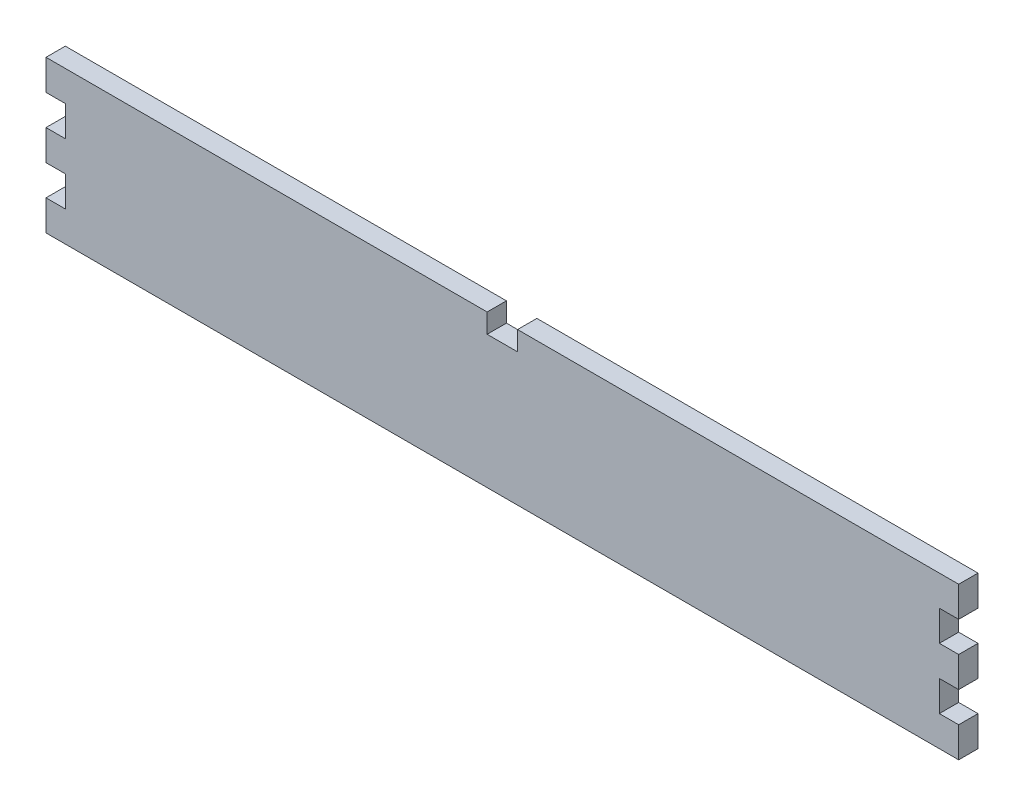
ISO-10303-21;
HEADER;
FILE_DESCRIPTION(('STEP AP214'),'2;1');
FILE_NAME('part.step','',(''),(''),'','','');
FILE_SCHEMA(('AUTOMOTIVE_DESIGN { 1 0 10303 214 1 1 1 1 }'));
ENDSEC;
DATA;
#1=APPLICATION_CONTEXT('core data for automotive mechanical design processes');
#2=APPLICATION_PROTOCOL_DEFINITION('international standard','automotive_design',2000,#1);
#3=PRODUCT_CONTEXT('',#1,'mechanical');
#4=PRODUCT('Part','Part','',(#3));
#5=PRODUCT_RELATED_PRODUCT_CATEGORY('part','',(#4));
#6=PRODUCT_DEFINITION_FORMATION('','',#4);
#7=PRODUCT_DEFINITION_CONTEXT('part definition',#1,'design');
#8=PRODUCT_DEFINITION('design','',#6,#7);
#9=PRODUCT_DEFINITION_SHAPE('','',#8);
#10=(LENGTH_UNIT() NAMED_UNIT(*) SI_UNIT(.MILLI.,.METRE.));
#11=(NAMED_UNIT(*) PLANE_ANGLE_UNIT() SI_UNIT($,.RADIAN.));
#12=(NAMED_UNIT(*) SI_UNIT($,.STERADIAN.) SOLID_ANGLE_UNIT());
#13=UNCERTAINTY_MEASURE_WITH_UNIT(LENGTH_MEASURE(1.E-05),#10,'distance_accuracy_value','');
#14=(GEOMETRIC_REPRESENTATION_CONTEXT(3) GLOBAL_UNCERTAINTY_ASSIGNED_CONTEXT((#13)) GLOBAL_UNIT_ASSIGNED_CONTEXT((#10,
#11,#12)) REPRESENTATION_CONTEXT('',''));
#15=CARTESIAN_POINT('',(0.,0.,0.));
#16=DIRECTION('',(0.,0.,1.));
#17=DIRECTION('',(1.,0.,0.));
#18=AXIS2_PLACEMENT_3D('',#15,#16,#17);
#19=CARTESIAN_POINT('',(0.,0.,6.35));
#20=DIRECTION('',(1.,0.,0.));
#21=DIRECTION('',(0.,0.,-1.));
#22=AXIS2_PLACEMENT_3D('',#19,#20,#21);
#23=PLANE('',#22);
#24=DIRECTION('',(0.,-1.,0.));
#25=VECTOR('',#24,1.);
#26=CARTESIAN_POINT('',(0.,0.,0.));
#27=LINE('',#26,#25);
#28=CARTESIAN_POINT('',(0.,30.,0.));
#29=VERTEX_POINT('',#28);
#30=CARTESIAN_POINT('',(0.,20.,0.));
#31=VERTEX_POINT('',#30);
#32=EDGE_CURVE('E415',#29,#31,#27,.T.);
#33=ORIENTED_EDGE('',*,*,#32,.T.);
#34=DIRECTION('',(0.,0.,1.));
#35=VECTOR('',#34,1.);
#36=CARTESIAN_POINT('',(0.,20.,0.));
#37=LINE('',#36,#35);
#38=CARTESIAN_POINT('',(0.,20.,6.35));
#39=VERTEX_POINT('',#38);
#40=EDGE_CURVE('E273',#31,#39,#37,.T.);
#41=ORIENTED_EDGE('',*,*,#40,.T.);
#42=DIRECTION('',(0.,-1.,0.));
#43=VECTOR('',#42,1.);
#44=CARTESIAN_POINT('',(0.,0.,6.35));
#45=LINE('',#44,#43);
#46=CARTESIAN_POINT('',(0.,30.,6.35));
#47=VERTEX_POINT('',#46);
#48=EDGE_CURVE('E394',#47,#39,#45,.T.);
#49=ORIENTED_EDGE('',*,*,#48,.F.);
#50=DIRECTION('',(0.,0.,1.));
#51=VECTOR('',#50,1.);
#52=CARTESIAN_POINT('',(0.,30.,0.));
#53=LINE('',#52,#51);
#54=EDGE_CURVE('E330',#29,#47,#53,.T.);
#55=ORIENTED_EDGE('',*,*,#54,.F.);
#56=EDGE_LOOP('',(#33,#41,#49,#55));
#57=FACE_BOUND('',#56,.T.);
#58=ADVANCED_FACE('F39',(#57),#23,.F.);
#59=CARTESIAN_POINT('',(300.,0.,6.35));
#60=DIRECTION('',(-1.,0.,0.));
#61=DIRECTION('',(0.,0.,1.));
#62=AXIS2_PLACEMENT_3D('',#59,#60,#61);
#63=PLANE('',#62);
#64=DIRECTION('',(0.,1.,0.));
#65=VECTOR('',#64,1.);
#66=CARTESIAN_POINT('',(300.,0.,6.35));
#67=LINE('',#66,#65);
#68=CARTESIAN_POINT('',(300.,40.,6.35));
#69=VERTEX_POINT('',#68);
#70=CARTESIAN_POINT('',(300.,50.,6.35));
#71=VERTEX_POINT('',#70);
#72=EDGE_CURVE('E398',#69,#71,#67,.T.);
#73=ORIENTED_EDGE('',*,*,#72,.F.);
#74=DIRECTION('',(0.,0.,1.));
#75=VECTOR('',#74,1.);
#76=CARTESIAN_POINT('',(300.,40.,0.));
#77=LINE('',#76,#75);
#78=CARTESIAN_POINT('',(300.,40.,0.));
#79=VERTEX_POINT('',#78);
#80=EDGE_CURVE('E310',#79,#69,#77,.T.);
#81=ORIENTED_EDGE('',*,*,#80,.F.);
#82=DIRECTION('',(0.,1.,0.));
#83=VECTOR('',#82,1.);
#84=CARTESIAN_POINT('',(300.,0.,0.));
#85=LINE('',#84,#83);
#86=CARTESIAN_POINT('',(300.,50.,0.));
#87=VERTEX_POINT('',#86);
#88=EDGE_CURVE('E418',#79,#87,#85,.T.);
#89=ORIENTED_EDGE('',*,*,#88,.T.);
#90=DIRECTION('',(0.,0.,-1.));
#91=VECTOR('',#90,1.);
#92=CARTESIAN_POINT('',(300.,50.,6.35));
#93=LINE('',#92,#91);
#94=EDGE_CURVE('E431',#71,#87,#93,.T.);
#95=ORIENTED_EDGE('',*,*,#94,.F.);
#96=EDGE_LOOP('',(#73,#81,#89,#95));
#97=FACE_BOUND('',#96,.T.);
#98=ADVANCED_FACE('F482',(#97),#63,.F.);
#99=CARTESIAN_POINT('',(300.,20.,0.));
#100=VERTEX_POINT('',#99);
#101=CARTESIAN_POINT('',(300.,30.,0.));
#102=VERTEX_POINT('',#101);
#103=EDGE_CURVE('E423',#100,#102,#85,.T.);
#104=ORIENTED_EDGE('',*,*,#103,.T.);
#105=DIRECTION('',(0.,0.,1.));
#106=VECTOR('',#105,1.);
#107=CARTESIAN_POINT('',(300.,30.,0.));
#108=LINE('',#107,#106);
#109=CARTESIAN_POINT('',(300.,30.,6.35));
#110=VERTEX_POINT('',#109);
#111=EDGE_CURVE('E63',#102,#110,#108,.T.);
#112=ORIENTED_EDGE('',*,*,#111,.T.);
#113=CARTESIAN_POINT('',(300.,20.,6.35));
#114=VERTEX_POINT('',#113);
#115=EDGE_CURVE('E404',#114,#110,#67,.T.);
#116=ORIENTED_EDGE('',*,*,#115,.F.);
#117=DIRECTION('',(0.,0.,1.));
#118=VECTOR('',#117,1.);
#119=CARTESIAN_POINT('',(300.,20.,0.));
#120=LINE('',#119,#118);
#121=EDGE_CURVE('E246',#100,#114,#120,.T.);
#122=ORIENTED_EDGE('',*,*,#121,.F.);
#123=EDGE_LOOP('',(#104,#112,#116,#122));
#124=FACE_BOUND('',#123,.T.);
#125=ADVANCED_FACE('F487',(#124),#63,.F.);
#126=CARTESIAN_POINT('',(0.,50.,0.));
#127=VERTEX_POINT('',#126);
#128=CARTESIAN_POINT('',(0.,40.,0.));
#129=VERTEX_POINT('',#128);
#130=EDGE_CURVE('E410',#127,#129,#27,.T.);
#131=ORIENTED_EDGE('',*,*,#130,.T.);
#132=DIRECTION('',(0.,0.,1.));
#133=VECTOR('',#132,1.);
#134=CARTESIAN_POINT('',(0.,40.,0.));
#135=LINE('',#134,#133);
#136=CARTESIAN_POINT('',(0.,40.,6.35));
#137=VERTEX_POINT('',#136);
#138=EDGE_CURVE('E340',#129,#137,#135,.T.);
#139=ORIENTED_EDGE('',*,*,#138,.T.);
#140=CARTESIAN_POINT('',(0.,50.,6.35));
#141=VERTEX_POINT('',#140);
#142=EDGE_CURVE('E389',#141,#137,#45,.T.);
#143=ORIENTED_EDGE('',*,*,#142,.F.);
#144=DIRECTION('',(0.,0.,-1.));
#145=VECTOR('',#144,1.);
#146=CARTESIAN_POINT('',(0.,50.,6.35));
#147=LINE('',#146,#145);
#148=EDGE_CURVE('E409',#141,#127,#147,.T.);
#149=ORIENTED_EDGE('',*,*,#148,.T.);
#150=EDGE_LOOP('',(#131,#139,#143,#149));
#151=FACE_BOUND('',#150,.T.);
#152=ADVANCED_FACE('F483',(#151),#23,.F.);
#153=CARTESIAN_POINT('',(0.,50.,6.35));
#154=DIRECTION('',(0.,-1.,0.));
#155=DIRECTION('',(0.,0.,-1.));
#156=AXIS2_PLACEMENT_3D('',#153,#154,#155);
#157=PLANE('',#156);
#158=DIRECTION('',(-1.,0.,0.));
#159=VECTOR('',#158,1.);
#160=CARTESIAN_POINT('',(0.,50.,0.));
#161=LINE('',#160,#159);
#162=CARTESIAN_POINT('',(155.,50.,0.));
#163=VERTEX_POINT('',#162);
#164=EDGE_CURVE('E424',#87,#163,#161,.T.);
#165=ORIENTED_EDGE('',*,*,#164,.T.);
#166=DIRECTION('',(0.,0.,1.));
#167=VECTOR('',#166,1.);
#168=CARTESIAN_POINT('',(155.,50.,0.));
#169=LINE('',#168,#167);
#170=CARTESIAN_POINT('',(155.,50.,6.35));
#171=VERTEX_POINT('',#170);
#172=EDGE_CURVE('E366',#163,#171,#169,.T.);
#173=ORIENTED_EDGE('',*,*,#172,.T.);
#174=DIRECTION('',(-1.,0.,0.));
#175=VECTOR('',#174,1.);
#176=CARTESIAN_POINT('',(0.,50.,6.35));
#177=LINE('',#176,#175);
#178=EDGE_CURVE('E405',#71,#171,#177,.T.);
#179=ORIENTED_EDGE('',*,*,#178,.F.);
#180=ORIENTED_EDGE('',*,*,#94,.T.);
#181=EDGE_LOOP('',(#165,#173,#179,#180));
#182=FACE_BOUND('',#181,.T.);
#183=ADVANCED_FACE('F491',(#182),#157,.F.);
#184=CARTESIAN_POINT('',(0.,9.99999999999999,6.35));
#185=VERTEX_POINT('',#184);
#186=CARTESIAN_POINT('',(0.,0.,6.35));
#187=VERTEX_POINT('',#186);
#188=EDGE_CURVE('E395',#185,#187,#45,.T.);
#189=ORIENTED_EDGE('',*,*,#188,.F.);
#190=DIRECTION('',(0.,0.,1.));
#191=VECTOR('',#190,1.);
#192=CARTESIAN_POINT('',(0.,9.99999999999999,0.));
#193=LINE('',#192,#191);
#194=CARTESIAN_POINT('',(0.,9.99999999999999,0.));
#195=VERTEX_POINT('',#194);
#196=EDGE_CURVE('E261',#195,#185,#193,.T.);
#197=ORIENTED_EDGE('',*,*,#196,.F.);
#198=CARTESIAN_POINT('',(0.,0.,0.));
#199=VERTEX_POINT('',#198);
#200=EDGE_CURVE('E379',#195,#199,#27,.T.);
#201=ORIENTED_EDGE('',*,*,#200,.T.);
#202=DIRECTION('',(0.,0.,-1.));
#203=VECTOR('',#202,1.);
#204=CARTESIAN_POINT('',(0.,0.,6.35));
#205=LINE('',#204,#203);
#206=EDGE_CURVE('E11',#187,#199,#205,.T.);
#207=ORIENTED_EDGE('',*,*,#206,.F.);
#208=EDGE_LOOP('',(#189,#197,#201,#207));
#209=FACE_BOUND('',#208,.T.);
#210=ADVANCED_FACE('F41',(#209),#23,.F.);
#211=CARTESIAN_POINT('',(0.,0.,6.35));
#212=DIRECTION('',(0.,1.,0.));
#213=DIRECTION('',(0.,0.,1.));
#214=AXIS2_PLACEMENT_3D('',#211,#212,#213);
#215=PLANE('',#214);
#216=DIRECTION('',(1.,0.,0.));
#217=VECTOR('',#216,1.);
#218=CARTESIAN_POINT('',(0.,0.,0.));
#219=LINE('',#218,#217);
#220=CARTESIAN_POINT('',(300.,0.,0.));
#221=VERTEX_POINT('',#220);
#222=EDGE_CURVE('E414',#199,#221,#219,.T.);
#223=ORIENTED_EDGE('',*,*,#222,.T.);
#224=DIRECTION('',(0.,0.,-1.));
#225=VECTOR('',#224,1.);
#226=CARTESIAN_POINT('',(300.,0.,6.35));
#227=LINE('',#226,#225);
#228=CARTESIAN_POINT('',(300.,0.,6.35));
#229=VERTEX_POINT('',#228);
#230=EDGE_CURVE('E48',#229,#221,#227,.T.);
#231=ORIENTED_EDGE('',*,*,#230,.F.);
#232=DIRECTION('',(1.,0.,0.));
#233=VECTOR('',#232,1.);
#234=CARTESIAN_POINT('',(0.,0.,6.35));
#235=LINE('',#234,#233);
#236=EDGE_CURVE('E393',#187,#229,#235,.T.);
#237=ORIENTED_EDGE('',*,*,#236,.F.);
#238=ORIENTED_EDGE('',*,*,#206,.T.);
#239=EDGE_LOOP('',(#223,#231,#237,#238));
#240=FACE_BOUND('',#239,.T.);
#241=ADVANCED_FACE('F445',(#240),#215,.F.);
#242=CARTESIAN_POINT('',(300.,9.99999999999999,0.));
#243=VERTEX_POINT('',#242);
#244=EDGE_CURVE('E419',#221,#243,#85,.T.);
#245=ORIENTED_EDGE('',*,*,#244,.T.);
#246=DIRECTION('',(0.,0.,1.));
#247=VECTOR('',#246,1.);
#248=CARTESIAN_POINT('',(300.,9.99999999999999,0.));
#249=LINE('',#248,#247);
#250=CARTESIAN_POINT('',(300.,9.99999999999999,6.35));
#251=VERTEX_POINT('',#250);
#252=EDGE_CURVE('E213',#243,#251,#249,.T.);
#253=ORIENTED_EDGE('',*,*,#252,.T.);
#254=EDGE_CURVE('E399',#229,#251,#67,.T.);
#255=ORIENTED_EDGE('',*,*,#254,.F.);
#256=ORIENTED_EDGE('',*,*,#230,.T.);
#257=EDGE_LOOP('',(#245,#253,#255,#256));
#258=FACE_BOUND('',#257,.T.);
#259=ADVANCED_FACE('F439',(#258),#63,.F.);
#260=CARTESIAN_POINT('',(145.,50.,6.35));
#261=VERTEX_POINT('',#260);
#262=EDGE_CURVE('E403',#261,#141,#177,.T.);
#263=ORIENTED_EDGE('',*,*,#262,.F.);
#264=DIRECTION('',(0.,0.,1.));
#265=VECTOR('',#264,1.);
#266=CARTESIAN_POINT('',(145.,50.,0.));
#267=LINE('',#266,#265);
#268=CARTESIAN_POINT('',(145.,50.,0.));
#269=VERTEX_POINT('',#268);
#270=EDGE_CURVE('E383',#269,#261,#267,.T.);
#271=ORIENTED_EDGE('',*,*,#270,.F.);
#272=EDGE_CURVE('E422',#269,#127,#161,.T.);
#273=ORIENTED_EDGE('',*,*,#272,.T.);
#274=ORIENTED_EDGE('',*,*,#148,.F.);
#275=EDGE_LOOP('',(#263,#271,#273,#274));
#276=FACE_BOUND('',#275,.T.);
#277=ADVANCED_FACE('F500',(#276),#157,.F.);
#278=CARTESIAN_POINT('',(0.,0.,6.35));
#279=DIRECTION('',(0.,0.,-1.));
#280=DIRECTION('',(-1.,0.,0.));
#281=AXIS2_PLACEMENT_3D('',#278,#279,#280);
#282=PLANE('',#281);
#283=ORIENTED_EDGE('',*,*,#48,.T.);
#284=DIRECTION('',(-1.,0.,0.));
#285=VECTOR('',#284,1.);
#286=CARTESIAN_POINT('',(6.35000000000001,20.,6.35));
#287=LINE('',#286,#285);
#288=CARTESIAN_POINT('',(6.35000000000001,20.,6.35));
#289=VERTEX_POINT('',#288);
#290=EDGE_CURVE('E255',#289,#39,#287,.T.);
#291=ORIENTED_EDGE('',*,*,#290,.F.);
#292=DIRECTION('',(0.,1.,0.));
#293=VECTOR('',#292,1.);
#294=CARTESIAN_POINT('',(6.35000000000001,9.99999999999999,6.35));
#295=LINE('',#294,#293);
#296=CARTESIAN_POINT('',(6.35000000000001,9.99999999999999,6.35));
#297=VERTEX_POINT('',#296);
#298=EDGE_CURVE('E266',#297,#289,#295,.T.);
#299=ORIENTED_EDGE('',*,*,#298,.F.);
#300=DIRECTION('',(1.,0.,0.));
#301=VECTOR('',#300,1.);
#302=CARTESIAN_POINT('',(6.35000000000001,9.99999999999999,6.35));
#303=LINE('',#302,#301);
#304=EDGE_CURVE('E262',#185,#297,#303,.T.);
#305=ORIENTED_EDGE('',*,*,#304,.F.);
#306=ORIENTED_EDGE('',*,*,#188,.T.);
#307=ORIENTED_EDGE('',*,*,#236,.T.);
#308=ORIENTED_EDGE('',*,*,#254,.T.);
#309=DIRECTION('',(1.,0.,0.));
#310=VECTOR('',#309,1.);
#311=CARTESIAN_POINT('',(300.,9.99999999999999,6.35));
#312=LINE('',#311,#310);
#313=CARTESIAN_POINT('',(293.65,9.99999999999999,6.35));
#314=VERTEX_POINT('',#313);
#315=EDGE_CURVE('E233',#314,#251,#312,.T.);
#316=ORIENTED_EDGE('',*,*,#315,.F.);
#317=DIRECTION('',(0.,-1.,0.));
#318=VECTOR('',#317,1.);
#319=CARTESIAN_POINT('',(293.65,9.99999999999999,6.35));
#320=LINE('',#319,#318);
#321=CARTESIAN_POINT('',(293.65,20.,6.35));
#322=VERTEX_POINT('',#321);
#323=EDGE_CURVE('E209',#322,#314,#320,.T.);
#324=ORIENTED_EDGE('',*,*,#323,.F.);
#325=DIRECTION('',(-1.,0.,0.));
#326=VECTOR('',#325,1.);
#327=CARTESIAN_POINT('',(300.,20.,6.35));
#328=LINE('',#327,#326);
#329=EDGE_CURVE('E229',#114,#322,#328,.T.);
#330=ORIENTED_EDGE('',*,*,#329,.F.);
#331=ORIENTED_EDGE('',*,*,#115,.T.);
#332=DIRECTION('',(1.,0.,0.));
#333=VECTOR('',#332,1.);
#334=CARTESIAN_POINT('',(300.,30.,6.35));
#335=LINE('',#334,#333);
#336=CARTESIAN_POINT('',(293.65,30.,6.35));
#337=VERTEX_POINT('',#336);
#338=EDGE_CURVE('E302',#337,#110,#335,.T.);
#339=ORIENTED_EDGE('',*,*,#338,.F.);
#340=DIRECTION('',(0.,-1.,0.));
#341=VECTOR('',#340,1.);
#342=CARTESIAN_POINT('',(293.65,30.,6.35));
#343=LINE('',#342,#341);
#344=CARTESIAN_POINT('',(293.65,40.,6.35));
#345=VERTEX_POINT('',#344);
#346=EDGE_CURVE('E245',#345,#337,#343,.T.);
#347=ORIENTED_EDGE('',*,*,#346,.F.);
#348=DIRECTION('',(-1.,0.,0.));
#349=VECTOR('',#348,1.);
#350=CARTESIAN_POINT('',(300.,40.,6.35));
#351=LINE('',#350,#349);
#352=EDGE_CURVE('E291',#69,#345,#351,.T.);
#353=ORIENTED_EDGE('',*,*,#352,.F.);
#354=ORIENTED_EDGE('',*,*,#72,.T.);
#355=ORIENTED_EDGE('',*,*,#178,.T.);
#356=DIRECTION('',(0.,1.,0.));
#357=VECTOR('',#356,1.);
#358=CARTESIAN_POINT('',(155.,43.65,6.35));
#359=LINE('',#358,#357);
#360=CARTESIAN_POINT('',(155.,43.65,6.35));
#361=VERTEX_POINT('',#360);
#362=EDGE_CURVE('E344',#361,#171,#359,.T.);
#363=ORIENTED_EDGE('',*,*,#362,.F.);
#364=DIRECTION('',(1.,0.,0.));
#365=VECTOR('',#364,1.);
#366=CARTESIAN_POINT('',(145.,43.65,6.35));
#367=LINE('',#366,#365);
#368=CARTESIAN_POINT('',(145.,43.65,6.35));
#369=VERTEX_POINT('',#368);
#370=EDGE_CURVE('E358',#369,#361,#367,.T.);
#371=ORIENTED_EDGE('',*,*,#370,.F.);
#372=DIRECTION('',(0.,-1.,0.));
#373=VECTOR('',#372,1.);
#374=CARTESIAN_POINT('',(145.,43.65,6.35));
#375=LINE('',#374,#373);
#376=EDGE_CURVE('E369',#261,#369,#375,.T.);
#377=ORIENTED_EDGE('',*,*,#376,.F.);
#378=ORIENTED_EDGE('',*,*,#262,.T.);
#379=ORIENTED_EDGE('',*,*,#142,.T.);
#380=DIRECTION('',(-1.,0.,0.));
#381=VECTOR('',#380,1.);
#382=CARTESIAN_POINT('',(6.35,40.,6.35));
#383=LINE('',#382,#381);
#384=CARTESIAN_POINT('',(6.35,40.,6.35));
#385=VERTEX_POINT('',#384);
#386=EDGE_CURVE('E322',#385,#137,#383,.T.);
#387=ORIENTED_EDGE('',*,*,#386,.F.);
#388=DIRECTION('',(0.,1.,0.));
#389=VECTOR('',#388,1.);
#390=CARTESIAN_POINT('',(6.35,30.,6.35));
#391=LINE('',#390,#389);
#392=CARTESIAN_POINT('',(6.35,30.,6.35));
#393=VERTEX_POINT('',#392);
#394=EDGE_CURVE('E334',#393,#385,#391,.T.);
#395=ORIENTED_EDGE('',*,*,#394,.F.);
#396=DIRECTION('',(1.,0.,0.));
#397=VECTOR('',#396,1.);
#398=CARTESIAN_POINT('',(6.35,30.,6.35));
#399=LINE('',#398,#397);
#400=EDGE_CURVE('E277',#47,#393,#399,.T.);
#401=ORIENTED_EDGE('',*,*,#400,.F.);
#402=EDGE_LOOP('',(#283,#291,#299,#305,#306,#307,#308,#316,#324,#330,#331,#339,#347,#353,#354,
#355,#363,#371,#377,#378,#379,#387,#395,#401));
#403=FACE_BOUND('',#402,.T.);
#404=ADVANCED_FACE('F463',(#403),#282,.F.);
#405=CARTESIAN_POINT('',(0.,0.,0.));
#406=DIRECTION('',(0.,0.,-1.));
#407=DIRECTION('',(-1.,0.,0.));
#408=AXIS2_PLACEMENT_3D('',#405,#406,#407);
#409=PLANE('',#408);
#410=DIRECTION('',(-1.,0.,0.));
#411=VECTOR('',#410,1.);
#412=CARTESIAN_POINT('',(6.35000000000001,20.,0.));
#413=LINE('',#412,#411);
#414=CARTESIAN_POINT('',(6.35000000000001,20.,0.));
#415=VERTEX_POINT('',#414);
#416=EDGE_CURVE('E258',#415,#31,#413,.T.);
#417=ORIENTED_EDGE('',*,*,#416,.T.);
#418=ORIENTED_EDGE('',*,*,#32,.F.);
#419=DIRECTION('',(1.,0.,0.));
#420=VECTOR('',#419,1.);
#421=CARTESIAN_POINT('',(6.35,30.,0.));
#422=LINE('',#421,#420);
#423=CARTESIAN_POINT('',(6.35,30.,0.));
#424=VERTEX_POINT('',#423);
#425=EDGE_CURVE('E317',#29,#424,#422,.T.);
#426=ORIENTED_EDGE('',*,*,#425,.T.);
#427=DIRECTION('',(0.,1.,0.));
#428=VECTOR('',#427,1.);
#429=CARTESIAN_POINT('',(6.35,30.,0.));
#430=LINE('',#429,#428);
#431=CARTESIAN_POINT('',(6.35,40.,0.));
#432=VERTEX_POINT('',#431);
#433=EDGE_CURVE('E321',#424,#432,#430,.T.);
#434=ORIENTED_EDGE('',*,*,#433,.T.);
#435=DIRECTION('',(-1.,0.,0.));
#436=VECTOR('',#435,1.);
#437=CARTESIAN_POINT('',(6.35,40.,0.));
#438=LINE('',#437,#436);
#439=EDGE_CURVE('E326',#432,#129,#438,.T.);
#440=ORIENTED_EDGE('',*,*,#439,.T.);
#441=ORIENTED_EDGE('',*,*,#130,.F.);
#442=ORIENTED_EDGE('',*,*,#272,.F.);
#443=DIRECTION('',(0.,-1.,0.));
#444=VECTOR('',#443,1.);
#445=CARTESIAN_POINT('',(145.,43.65,0.));
#446=LINE('',#445,#444);
#447=CARTESIAN_POINT('',(145.,43.65,0.));
#448=VERTEX_POINT('',#447);
#449=EDGE_CURVE('E357',#269,#448,#446,.T.);
#450=ORIENTED_EDGE('',*,*,#449,.T.);
#451=DIRECTION('',(1.,0.,0.));
#452=VECTOR('',#451,1.);
#453=CARTESIAN_POINT('',(145.,43.65,0.));
#454=LINE('',#453,#452);
#455=CARTESIAN_POINT('',(155.,43.65,0.));
#456=VERTEX_POINT('',#455);
#457=EDGE_CURVE('E362',#448,#456,#454,.T.);
#458=ORIENTED_EDGE('',*,*,#457,.T.);
#459=DIRECTION('',(0.,1.,0.));
#460=VECTOR('',#459,1.);
#461=CARTESIAN_POINT('',(155.,43.65,0.));
#462=LINE('',#461,#460);
#463=EDGE_CURVE('E353',#456,#163,#462,.T.);
#464=ORIENTED_EDGE('',*,*,#463,.T.);
#465=ORIENTED_EDGE('',*,*,#164,.F.);
#466=ORIENTED_EDGE('',*,*,#88,.F.);
#467=DIRECTION('',(-1.,0.,0.));
#468=VECTOR('',#467,1.);
#469=CARTESIAN_POINT('',(300.,40.,0.));
#470=LINE('',#469,#468);
#471=CARTESIAN_POINT('',(293.65,40.,0.));
#472=VERTEX_POINT('',#471);
#473=EDGE_CURVE('E294',#79,#472,#470,.T.);
#474=ORIENTED_EDGE('',*,*,#473,.T.);
#475=DIRECTION('',(0.,-1.,0.));
#476=VECTOR('',#475,1.);
#477=CARTESIAN_POINT('',(293.65,30.,0.));
#478=LINE('',#477,#476);
#479=CARTESIAN_POINT('',(293.65,30.,0.));
#480=VERTEX_POINT('',#479);
#481=EDGE_CURVE('E286',#472,#480,#478,.T.);
#482=ORIENTED_EDGE('',*,*,#481,.T.);
#483=DIRECTION('',(1.,0.,0.));
#484=VECTOR('',#483,1.);
#485=CARTESIAN_POINT('',(300.,30.,0.));
#486=LINE('',#485,#484);
#487=EDGE_CURVE('E290',#480,#102,#486,.T.);
#488=ORIENTED_EDGE('',*,*,#487,.T.);
#489=ORIENTED_EDGE('',*,*,#103,.F.);
#490=DIRECTION('',(-1.,0.,0.));
#491=VECTOR('',#490,1.);
#492=CARTESIAN_POINT('',(300.,20.,0.));
#493=LINE('',#492,#491);
#494=CARTESIAN_POINT('',(293.65,20.,0.));
#495=VERTEX_POINT('',#494);
#496=EDGE_CURVE('E214',#100,#495,#493,.T.);
#497=ORIENTED_EDGE('',*,*,#496,.T.);
#498=DIRECTION('',(0.,-1.,0.));
#499=VECTOR('',#498,1.);
#500=CARTESIAN_POINT('',(293.65,9.99999999999999,0.));
#501=LINE('',#500,#499);
#502=CARTESIAN_POINT('',(293.65,9.99999999999999,0.));
#503=VERTEX_POINT('',#502);
#504=EDGE_CURVE('E206',#495,#503,#501,.T.);
#505=ORIENTED_EDGE('',*,*,#504,.T.);
#506=DIRECTION('',(1.,0.,0.));
#507=VECTOR('',#506,1.);
#508=CARTESIAN_POINT('',(300.,9.99999999999999,0.));
#509=LINE('',#508,#507);
#510=EDGE_CURVE('E217',#503,#243,#509,.T.);
#511=ORIENTED_EDGE('',*,*,#510,.T.);
#512=ORIENTED_EDGE('',*,*,#244,.F.);
#513=ORIENTED_EDGE('',*,*,#222,.F.);
#514=ORIENTED_EDGE('',*,*,#200,.F.);
#515=DIRECTION('',(1.,0.,0.));
#516=VECTOR('',#515,1.);
#517=CARTESIAN_POINT('',(6.35000000000001,9.99999999999999,0.));
#518=LINE('',#517,#516);
#519=CARTESIAN_POINT('',(6.35000000000001,9.99999999999999,0.));
#520=VERTEX_POINT('',#519);
#521=EDGE_CURVE('E251',#195,#520,#518,.T.);
#522=ORIENTED_EDGE('',*,*,#521,.T.);
#523=DIRECTION('',(0.,1.,0.));
#524=VECTOR('',#523,1.);
#525=CARTESIAN_POINT('',(6.35000000000001,9.99999999999999,0.));
#526=LINE('',#525,#524);
#527=EDGE_CURVE('E55',#520,#415,#526,.T.);
#528=ORIENTED_EDGE('',*,*,#527,.T.);
#529=EDGE_LOOP('',(#417,#418,#426,#434,#440,#441,#442,#450,#458,#464,#465,#466,#474,#482,#488,
#489,#497,#505,#511,#512,#513,#514,#522,#528));
#530=FACE_BOUND('',#529,.T.);
#531=ADVANCED_FACE('F226',(#530),#409,.T.);
#532=CARTESIAN_POINT('',(155.,43.65,0.));
#533=DIRECTION('',(1.,0.,0.));
#534=DIRECTION('',(0.,0.,-1.));
#535=AXIS2_PLACEMENT_3D('',#532,#533,#534);
#536=PLANE('',#535);
#537=ORIENTED_EDGE('',*,*,#362,.T.);
#538=ORIENTED_EDGE('',*,*,#172,.F.);
#539=ORIENTED_EDGE('',*,*,#463,.F.);
#540=DIRECTION('',(0.,0.,1.));
#541=VECTOR('',#540,1.);
#542=CARTESIAN_POINT('',(155.,43.65,0.));
#543=LINE('',#542,#541);
#544=EDGE_CURVE('E376',#456,#361,#543,.T.);
#545=ORIENTED_EDGE('',*,*,#544,.T.);
#546=EDGE_LOOP('',(#537,#538,#539,#545));
#547=FACE_BOUND('',#546,.T.);
#548=ADVANCED_FACE('F532',(#547),#536,.F.);
#549=CARTESIAN_POINT('',(145.,43.65,0.));
#550=DIRECTION('',(0.,-1.,0.));
#551=DIRECTION('',(0.,0.,-1.));
#552=AXIS2_PLACEMENT_3D('',#549,#550,#551);
#553=PLANE('',#552);
#554=ORIENTED_EDGE('',*,*,#370,.T.);
#555=ORIENTED_EDGE('',*,*,#544,.F.);
#556=ORIENTED_EDGE('',*,*,#457,.F.);
#557=DIRECTION('',(0.,0.,1.));
#558=VECTOR('',#557,1.);
#559=CARTESIAN_POINT('',(145.,43.65,0.));
#560=LINE('',#559,#558);
#561=EDGE_CURVE('E380',#448,#369,#560,.T.);
#562=ORIENTED_EDGE('',*,*,#561,.T.);
#563=EDGE_LOOP('',(#554,#555,#556,#562));
#564=FACE_BOUND('',#563,.T.);
#565=ADVANCED_FACE('F535',(#564),#553,.F.);
#566=CARTESIAN_POINT('',(145.,43.65,0.));
#567=DIRECTION('',(-1.,0.,0.));
#568=DIRECTION('',(0.,0.,1.));
#569=AXIS2_PLACEMENT_3D('',#566,#567,#568);
#570=PLANE('',#569);
#571=ORIENTED_EDGE('',*,*,#376,.T.);
#572=ORIENTED_EDGE('',*,*,#561,.F.);
#573=ORIENTED_EDGE('',*,*,#449,.F.);
#574=ORIENTED_EDGE('',*,*,#270,.T.);
#575=EDGE_LOOP('',(#571,#572,#573,#574));
#576=FACE_BOUND('',#575,.T.);
#577=ADVANCED_FACE('F537',(#576),#570,.F.);
#578=CARTESIAN_POINT('',(6.35,40.,0.));
#579=DIRECTION('',(0.,1.,0.));
#580=DIRECTION('',(0.,0.,1.));
#581=AXIS2_PLACEMENT_3D('',#578,#579,#580);
#582=PLANE('',#581);
#583=ORIENTED_EDGE('',*,*,#386,.T.);
#584=ORIENTED_EDGE('',*,*,#138,.F.);
#585=ORIENTED_EDGE('',*,*,#439,.F.);
#586=DIRECTION('',(0.,0.,1.));
#587=VECTOR('',#586,1.);
#588=CARTESIAN_POINT('',(6.35,40.,0.));
#589=LINE('',#588,#587);
#590=EDGE_CURVE('E345',#432,#385,#589,.T.);
#591=ORIENTED_EDGE('',*,*,#590,.T.);
#592=EDGE_LOOP('',(#583,#584,#585,#591));
#593=FACE_BOUND('',#592,.T.);
#594=ADVANCED_FACE('F540',(#593),#582,.F.);
#595=CARTESIAN_POINT('',(6.35,30.,0.));
#596=DIRECTION('',(1.,0.,0.));
#597=DIRECTION('',(0.,0.,-1.));
#598=AXIS2_PLACEMENT_3D('',#595,#596,#597);
#599=PLANE('',#598);
#600=ORIENTED_EDGE('',*,*,#394,.T.);
#601=ORIENTED_EDGE('',*,*,#590,.F.);
#602=ORIENTED_EDGE('',*,*,#433,.F.);
#603=DIRECTION('',(0.,0.,1.));
#604=VECTOR('',#603,1.);
#605=CARTESIAN_POINT('',(6.35,30.,0.));
#606=LINE('',#605,#604);
#607=EDGE_CURVE('E348',#424,#393,#606,.T.);
#608=ORIENTED_EDGE('',*,*,#607,.T.);
#609=EDGE_LOOP('',(#600,#601,#602,#608));
#610=FACE_BOUND('',#609,.T.);
#611=ADVANCED_FACE('F546',(#610),#599,.F.);
#612=CARTESIAN_POINT('',(6.35,30.,0.));
#613=DIRECTION('',(0.,-1.,0.));
#614=DIRECTION('',(0.,0.,-1.));
#615=AXIS2_PLACEMENT_3D('',#612,#613,#614);
#616=PLANE('',#615);
#617=ORIENTED_EDGE('',*,*,#400,.T.);
#618=ORIENTED_EDGE('',*,*,#607,.F.);
#619=ORIENTED_EDGE('',*,*,#425,.F.);
#620=ORIENTED_EDGE('',*,*,#54,.T.);
#621=EDGE_LOOP('',(#617,#618,#619,#620));
#622=FACE_BOUND('',#621,.T.);
#623=ADVANCED_FACE('F593',(#622),#616,.F.);
#624=CARTESIAN_POINT('',(293.65,9.99999999999999,0.));
#625=DIRECTION('',(-1.,0.,0.));
#626=DIRECTION('',(0.,0.,1.));
#627=AXIS2_PLACEMENT_3D('',#624,#625,#626);
#628=PLANE('',#627);
#629=ORIENTED_EDGE('',*,*,#323,.T.);
#630=DIRECTION('',(0.,0.,1.));
#631=VECTOR('',#630,1.);
#632=CARTESIAN_POINT('',(293.65,9.99999999999999,0.));
#633=LINE('',#632,#631);
#634=EDGE_CURVE('E202',#503,#314,#633,.T.);
#635=ORIENTED_EDGE('',*,*,#634,.F.);
#636=ORIENTED_EDGE('',*,*,#504,.F.);
#637=DIRECTION('',(0.,0.,1.));
#638=VECTOR('',#637,1.);
#639=CARTESIAN_POINT('',(293.65,20.,0.));
#640=LINE('',#639,#638);
#641=EDGE_CURVE('E242',#495,#322,#640,.T.);
#642=ORIENTED_EDGE('',*,*,#641,.T.);
#643=EDGE_LOOP('',(#629,#635,#636,#642));
#644=FACE_BOUND('',#643,.T.);
#645=ADVANCED_FACE('F204',(#644),#628,.F.);
#646=CARTESIAN_POINT('',(300.,20.,0.));
#647=DIRECTION('',(0.,1.,0.));
#648=DIRECTION('',(0.,0.,1.));
#649=AXIS2_PLACEMENT_3D('',#646,#647,#648);
#650=PLANE('',#649);
#651=ORIENTED_EDGE('',*,*,#329,.T.);
#652=ORIENTED_EDGE('',*,*,#641,.F.);
#653=ORIENTED_EDGE('',*,*,#496,.F.);
#654=ORIENTED_EDGE('',*,*,#121,.T.);
#655=EDGE_LOOP('',(#651,#652,#653,#654));
#656=FACE_BOUND('',#655,.T.);
#657=ADVANCED_FACE('F673',(#656),#650,.F.);
#658=CARTESIAN_POINT('',(300.,9.99999999999999,0.));
#659=DIRECTION('',(0.,-1.,0.));
#660=DIRECTION('',(0.,0.,-1.));
#661=AXIS2_PLACEMENT_3D('',#658,#659,#660);
#662=PLANE('',#661);
#663=ORIENTED_EDGE('',*,*,#315,.T.);
#664=ORIENTED_EDGE('',*,*,#252,.F.);
#665=ORIENTED_EDGE('',*,*,#510,.F.);
#666=ORIENTED_EDGE('',*,*,#634,.T.);
#667=EDGE_LOOP('',(#663,#664,#665,#666));
#668=FACE_BOUND('',#667,.T.);
#669=ADVANCED_FACE('F218',(#668),#662,.F.);
#670=CARTESIAN_POINT('',(293.65,30.,0.));
#671=DIRECTION('',(-1.,0.,0.));
#672=DIRECTION('',(0.,0.,1.));
#673=AXIS2_PLACEMENT_3D('',#670,#671,#672);
#674=PLANE('',#673);
#675=ORIENTED_EDGE('',*,*,#346,.T.);
#676=DIRECTION('',(0.,0.,1.));
#677=VECTOR('',#676,1.);
#678=CARTESIAN_POINT('',(293.65,30.,0.));
#679=LINE('',#678,#677);
#680=EDGE_CURVE('E298',#480,#337,#679,.T.);
#681=ORIENTED_EDGE('',*,*,#680,.F.);
#682=ORIENTED_EDGE('',*,*,#481,.F.);
#683=DIRECTION('',(0.,0.,1.));
#684=VECTOR('',#683,1.);
#685=CARTESIAN_POINT('',(293.65,40.,0.));
#686=LINE('',#685,#684);
#687=EDGE_CURVE('E267',#472,#345,#686,.T.);
#688=ORIENTED_EDGE('',*,*,#687,.T.);
#689=EDGE_LOOP('',(#675,#681,#682,#688));
#690=FACE_BOUND('',#689,.T.);
#691=ADVANCED_FACE('F670',(#690),#674,.F.);
#692=CARTESIAN_POINT('',(300.,40.,0.));
#693=DIRECTION('',(0.,1.,0.));
#694=DIRECTION('',(0.,0.,1.));
#695=AXIS2_PLACEMENT_3D('',#692,#693,#694);
#696=PLANE('',#695);
#697=ORIENTED_EDGE('',*,*,#352,.T.);
#698=ORIENTED_EDGE('',*,*,#687,.F.);
#699=ORIENTED_EDGE('',*,*,#473,.F.);
#700=ORIENTED_EDGE('',*,*,#80,.T.);
#701=EDGE_LOOP('',(#697,#698,#699,#700));
#702=FACE_BOUND('',#701,.T.);
#703=ADVANCED_FACE('F700',(#702),#696,.F.);
#704=CARTESIAN_POINT('',(300.,30.,0.));
#705=DIRECTION('',(0.,-1.,0.));
#706=DIRECTION('',(0.,0.,-1.));
#707=AXIS2_PLACEMENT_3D('',#704,#705,#706);
#708=PLANE('',#707);
#709=ORIENTED_EDGE('',*,*,#338,.T.);
#710=ORIENTED_EDGE('',*,*,#111,.F.);
#711=ORIENTED_EDGE('',*,*,#487,.F.);
#712=ORIENTED_EDGE('',*,*,#680,.T.);
#713=EDGE_LOOP('',(#709,#710,#711,#712));
#714=FACE_BOUND('',#713,.T.);
#715=ADVANCED_FACE('F479',(#714),#708,.F.);
#716=CARTESIAN_POINT('',(6.35000000000001,20.,0.));
#717=DIRECTION('',(0.,1.,0.));
#718=DIRECTION('',(0.,0.,1.));
#719=AXIS2_PLACEMENT_3D('',#716,#717,#718);
#720=PLANE('',#719);
#721=ORIENTED_EDGE('',*,*,#290,.T.);
#722=ORIENTED_EDGE('',*,*,#40,.F.);
#723=ORIENTED_EDGE('',*,*,#416,.F.);
#724=DIRECTION('',(0.,0.,1.));
#725=VECTOR('',#724,1.);
#726=CARTESIAN_POINT('',(6.35000000000001,20.,0.));
#727=LINE('',#726,#725);
#728=EDGE_CURVE('E278',#415,#289,#727,.T.);
#729=ORIENTED_EDGE('',*,*,#728,.T.);
#730=EDGE_LOOP('',(#721,#722,#723,#729));
#731=FACE_BOUND('',#730,.T.);
#732=ADVANCED_FACE('F459',(#731),#720,.F.);
#733=CARTESIAN_POINT('',(6.35000000000001,9.99999999999999,0.));
#734=DIRECTION('',(1.,0.,0.));
#735=DIRECTION('',(0.,0.,-1.));
#736=AXIS2_PLACEMENT_3D('',#733,#734,#735);
#737=PLANE('',#736);
#738=ORIENTED_EDGE('',*,*,#298,.T.);
#739=ORIENTED_EDGE('',*,*,#728,.F.);
#740=ORIENTED_EDGE('',*,*,#527,.F.);
#741=DIRECTION('',(0.,0.,1.));
#742=VECTOR('',#741,1.);
#743=CARTESIAN_POINT('',(6.35000000000001,9.99999999999999,0.));
#744=LINE('',#743,#742);
#745=EDGE_CURVE('E281',#520,#297,#744,.T.);
#746=ORIENTED_EDGE('',*,*,#745,.T.);
#747=EDGE_LOOP('',(#738,#739,#740,#746));
#748=FACE_BOUND('',#747,.T.);
#749=ADVANCED_FACE('F471',(#748),#737,.F.);
#750=CARTESIAN_POINT('',(6.35000000000001,9.99999999999999,0.));
#751=DIRECTION('',(0.,-1.,0.));
#752=DIRECTION('',(0.,0.,-1.));
#753=AXIS2_PLACEMENT_3D('',#750,#751,#752);
#754=PLANE('',#753);
#755=ORIENTED_EDGE('',*,*,#304,.T.);
#756=ORIENTED_EDGE('',*,*,#745,.F.);
#757=ORIENTED_EDGE('',*,*,#521,.F.);
#758=ORIENTED_EDGE('',*,*,#196,.T.);
#759=EDGE_LOOP('',(#755,#756,#757,#758));
#760=FACE_BOUND('',#759,.T.);
#761=ADVANCED_FACE('F470',(#760),#754,.F.);
#762=CLOSED_SHELL('',(#58,#98,#125,#152,#183,#210,#241,#259,#277,#404,#531,#548,#565,#577,#594,
#611,#623,#645,#657,#669,#691,#703,#715,#732,#749,#761));
#763=MANIFOLD_SOLID_BREP('B2',#762);
#764=ADVANCED_BREP_SHAPE_REPRESENTATION('',(#18,#763),#14);
#765=SHAPE_DEFINITION_REPRESENTATION(#9,#764);
ENDSEC;
END-ISO-10303-21;
